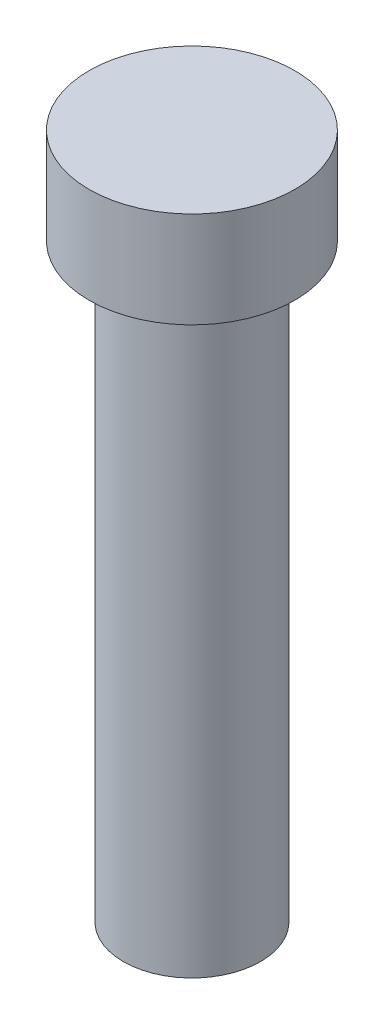
ISO-10303-21;
HEADER;
FILE_DESCRIPTION(('STEP AP214'),'2;1');
FILE_NAME('part.step','',(''),(''),'','','');
FILE_SCHEMA(('AUTOMOTIVE_DESIGN { 1 0 10303 214 1 1 1 1 }'));
ENDSEC;
DATA;
#1=APPLICATION_CONTEXT('core data for automotive mechanical design processes');
#2=APPLICATION_PROTOCOL_DEFINITION('international standard','automotive_design',2000,#1);
#3=PRODUCT_CONTEXT('',#1,'mechanical');
#4=PRODUCT('Part','Part','',(#3));
#5=PRODUCT_RELATED_PRODUCT_CATEGORY('part','',(#4));
#6=PRODUCT_DEFINITION_FORMATION('','',#4);
#7=PRODUCT_DEFINITION_CONTEXT('part definition',#1,'design');
#8=PRODUCT_DEFINITION('design','',#6,#7);
#9=PRODUCT_DEFINITION_SHAPE('','',#8);
#10=(LENGTH_UNIT() NAMED_UNIT(*) SI_UNIT(.MILLI.,.METRE.));
#11=(NAMED_UNIT(*) PLANE_ANGLE_UNIT() SI_UNIT($,.RADIAN.));
#12=(NAMED_UNIT(*) SI_UNIT($,.STERADIAN.) SOLID_ANGLE_UNIT());
#13=UNCERTAINTY_MEASURE_WITH_UNIT(LENGTH_MEASURE(1.E-05),#10,'distance_accuracy_value','');
#14=(GEOMETRIC_REPRESENTATION_CONTEXT(3) GLOBAL_UNCERTAINTY_ASSIGNED_CONTEXT((#13)) GLOBAL_UNIT_ASSIGNED_CONTEXT((#10,
#11,#12)) REPRESENTATION_CONTEXT('',''));
#15=CARTESIAN_POINT('',(0.,0.,0.));
#16=DIRECTION('',(0.,0.,1.));
#17=DIRECTION('',(1.,0.,0.));
#18=AXIS2_PLACEMENT_3D('',#15,#16,#17);
#19=CARTESIAN_POINT('',(0.,7.,0.));
#20=DIRECTION('',(0.,-1.,0.));
#21=DIRECTION('',(0.,0.,-1.));
#22=AXIS2_PLACEMENT_3D('',#19,#20,#21);
#23=CYLINDRICAL_SURFACE('',#22,7.5);
#24=CARTESIAN_POINT('',(0.,7.,0.));
#25=DIRECTION('',(0.,1.,0.));
#26=DIRECTION('',(0.,0.,1.));
#27=AXIS2_PLACEMENT_3D('',#24,#25,#26);
#28=CIRCLE('',#27,7.5);
#29=CARTESIAN_POINT('',(0.,7.,7.5));
#30=VERTEX_POINT('',#29);
#31=EDGE_CURVE('E10',#30,#30,#28,.T.);
#32=ORIENTED_EDGE('',*,*,#31,.F.);
#33=EDGE_LOOP('',(#32));
#34=FACE_BOUND('',#33,.T.);
#35=CARTESIAN_POINT('',(0.,0.,0.));
#36=DIRECTION('',(0.,1.,0.));
#37=DIRECTION('',(0.,0.,1.));
#38=AXIS2_PLACEMENT_3D('',#35,#36,#37);
#39=CIRCLE('',#38,7.5);
#40=CARTESIAN_POINT('',(0.,0.,7.5));
#41=VERTEX_POINT('',#40);
#42=EDGE_CURVE('E40',#41,#41,#39,.T.);
#43=ORIENTED_EDGE('',*,*,#42,.T.);
#44=EDGE_LOOP('',(#43));
#45=FACE_BOUND('',#44,.T.);
#46=ADVANCED_FACE('F37',(#34,#45),#23,.T.);
#47=CARTESIAN_POINT('',(0.,7.,0.));
#48=DIRECTION('',(0.,1.,0.));
#49=DIRECTION('',(0.,0.,1.));
#50=AXIS2_PLACEMENT_3D('',#47,#48,#49);
#51=PLANE('',#50);
#52=ORIENTED_EDGE('',*,*,#31,.T.);
#53=EDGE_LOOP('',(#52));
#54=FACE_BOUND('',#53,.T.);
#55=ADVANCED_FACE('F67',(#54),#51,.T.);
#56=CARTESIAN_POINT('',(0.,0.,0.));
#57=DIRECTION('',(0.,1.,0.));
#58=DIRECTION('',(0.,0.,1.));
#59=AXIS2_PLACEMENT_3D('',#56,#57,#58);
#60=PLANE('',#59);
#61=CARTESIAN_POINT('',(0.,0.,0.));
#62=DIRECTION('',(0.,1.,0.));
#63=DIRECTION('',(0.,0.,1.));
#64=AXIS2_PLACEMENT_3D('',#61,#62,#63);
#65=CIRCLE('',#64,5.);
#66=CARTESIAN_POINT('',(0.,0.,5.));
#67=VERTEX_POINT('',#66);
#68=EDGE_CURVE('E49',#67,#67,#65,.T.);
#69=ORIENTED_EDGE('',*,*,#68,.T.);
#70=EDGE_LOOP('',(#69));
#71=FACE_BOUND('',#70,.T.);
#72=ORIENTED_EDGE('',*,*,#42,.F.);
#73=EDGE_LOOP('',(#72));
#74=FACE_BOUND('',#73,.T.);
#75=ADVANCED_FACE('F64',(#71,#74),#60,.F.);
#76=CARTESIAN_POINT('',(0.,-43.,0.));
#77=DIRECTION('',(0.,1.,0.));
#78=DIRECTION('',(0.,0.,1.));
#79=AXIS2_PLACEMENT_3D('',#76,#77,#78);
#80=CYLINDRICAL_SURFACE('',#79,5.);
#81=CARTESIAN_POINT('',(0.,-43.,0.));
#82=DIRECTION('',(0.,1.,0.));
#83=DIRECTION('',(0.,0.,1.));
#84=AXIS2_PLACEMENT_3D('',#81,#82,#83);
#85=CIRCLE('',#84,5.);
#86=CARTESIAN_POINT('',(0.,-43.,5.));
#87=VERTEX_POINT('',#86);
#88=EDGE_CURVE('E47',#87,#87,#85,.T.);
#89=ORIENTED_EDGE('',*,*,#88,.T.);
#90=EDGE_LOOP('',(#89));
#91=FACE_BOUND('',#90,.T.);
#92=ORIENTED_EDGE('',*,*,#68,.F.);
#93=EDGE_LOOP('',(#92));
#94=FACE_BOUND('',#93,.T.);
#95=ADVANCED_FACE('F55',(#91,#94),#80,.T.);
#96=CARTESIAN_POINT('',(0.,-43.,0.));
#97=DIRECTION('',(0.,1.,0.));
#98=DIRECTION('',(0.,0.,1.));
#99=AXIS2_PLACEMENT_3D('',#96,#97,#98);
#100=PLANE('',#99);
#101=ORIENTED_EDGE('',*,*,#88,.F.);
#102=EDGE_LOOP('',(#101));
#103=FACE_BOUND('',#102,.T.);
#104=ADVANCED_FACE('F58',(#103),#100,.F.);
#105=CLOSED_SHELL('',(#46,#55,#75,#95,#104));
#106=MANIFOLD_SOLID_BREP('B2',#105);
#107=ADVANCED_BREP_SHAPE_REPRESENTATION('',(#18,#106),#14);
#108=SHAPE_DEFINITION_REPRESENTATION(#9,#107);
ENDSEC;
END-ISO-10303-21;
